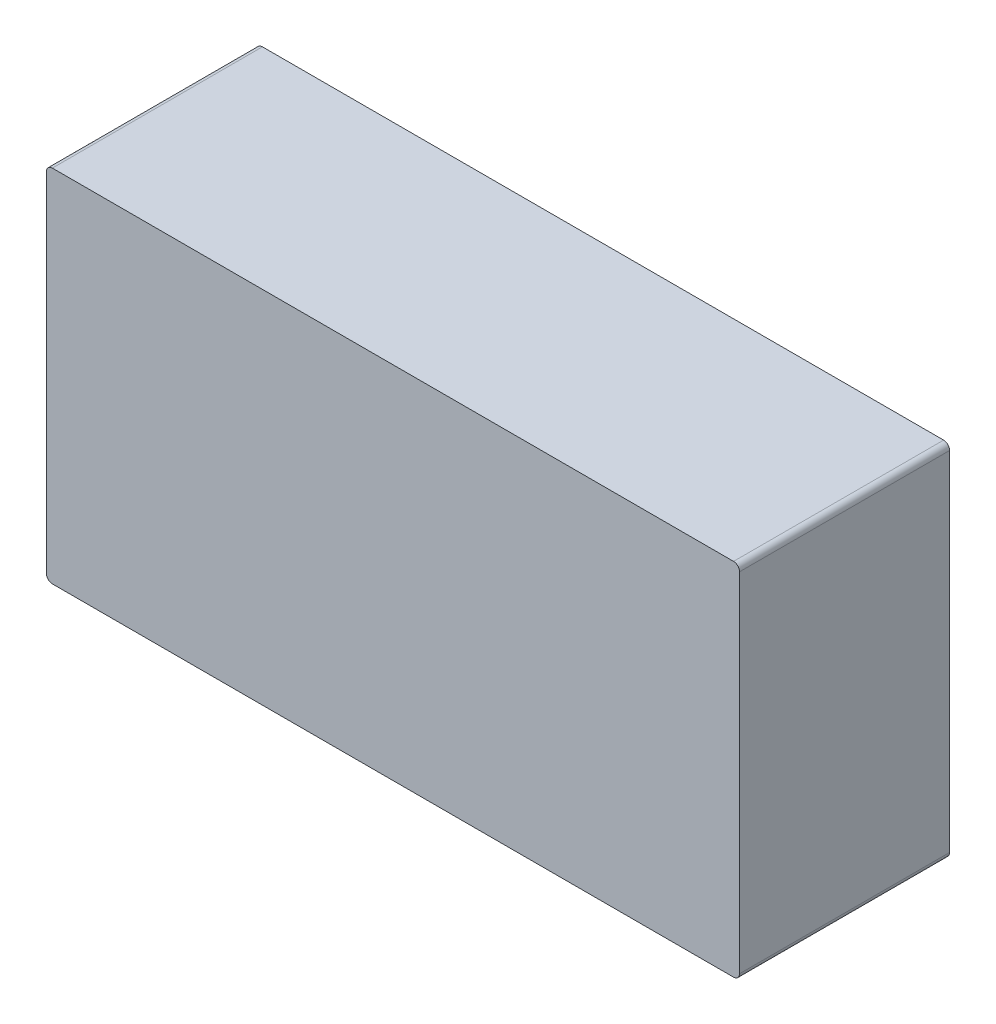
ISO-10303-21;
HEADER;
FILE_DESCRIPTION(('STEP AP214'),'2;1');
FILE_NAME('part.step','',(''),(''),'','','');
FILE_SCHEMA(('AUTOMOTIVE_DESIGN { 1 0 10303 214 1 1 1 1 }'));
ENDSEC;
DATA;
#1=APPLICATION_CONTEXT('core data for automotive mechanical design processes');
#2=APPLICATION_PROTOCOL_DEFINITION('international standard','automotive_design',2000,#1);
#3=PRODUCT_CONTEXT('',#1,'mechanical');
#4=PRODUCT('Part','Part','',(#3));
#5=PRODUCT_RELATED_PRODUCT_CATEGORY('part','',(#4));
#6=PRODUCT_DEFINITION_FORMATION('','',#4);
#7=PRODUCT_DEFINITION_CONTEXT('part definition',#1,'design');
#8=PRODUCT_DEFINITION('design','',#6,#7);
#9=PRODUCT_DEFINITION_SHAPE('','',#8);
#10=(LENGTH_UNIT() NAMED_UNIT(*) SI_UNIT(.MILLI.,.METRE.));
#11=(NAMED_UNIT(*) PLANE_ANGLE_UNIT() SI_UNIT($,.RADIAN.));
#12=(NAMED_UNIT(*) SI_UNIT($,.STERADIAN.) SOLID_ANGLE_UNIT());
#13=UNCERTAINTY_MEASURE_WITH_UNIT(LENGTH_MEASURE(1.E-05),#10,'distance_accuracy_value','');
#14=(GEOMETRIC_REPRESENTATION_CONTEXT(3) GLOBAL_UNCERTAINTY_ASSIGNED_CONTEXT((#13)) GLOBAL_UNIT_ASSIGNED_CONTEXT((#10,
#11,#12)) REPRESENTATION_CONTEXT('',''));
#15=CARTESIAN_POINT('',(0.,0.,0.));
#16=DIRECTION('',(0.,0.,1.));
#17=DIRECTION('',(1.,0.,0.));
#18=AXIS2_PLACEMENT_3D('',#15,#16,#17);
#19=CARTESIAN_POINT('',(0.,0.,14.));
#20=DIRECTION('',(0.,0.,1.));
#21=DIRECTION('',(1.,0.,0.));
#22=AXIS2_PLACEMENT_3D('',#19,#20,#21);
#23=PLANE('',#22);
#24=CARTESIAN_POINT('',(-11.15,5.8,14.));
#25=DIRECTION('',(0.,0.,-1.));
#26=DIRECTION('',(-1.,0.,0.));
#27=AXIS2_PLACEMENT_3D('',#24,#25,#26);
#28=CIRCLE('',#27,0.2);
#29=CARTESIAN_POINT('',(-11.35,5.8,14.));
#30=VERTEX_POINT('',#29);
#31=CARTESIAN_POINT('',(-11.15,6.,14.));
#32=VERTEX_POINT('',#31);
#33=EDGE_CURVE('E90',#30,#32,#28,.T.);
#34=ORIENTED_EDGE('',*,*,#33,.F.);
#35=DIRECTION('',(0.,-1.,0.));
#36=VECTOR('',#35,1.);
#37=CARTESIAN_POINT('',(-11.35,5.75,14.));
#38=LINE('',#37,#36);
#39=CARTESIAN_POINT('',(-11.35,-5.8,14.));
#40=VERTEX_POINT('',#39);
#41=EDGE_CURVE('E82',#30,#40,#38,.T.);
#42=ORIENTED_EDGE('',*,*,#41,.T.);
#43=CARTESIAN_POINT('',(-11.15,-5.8,14.));
#44=DIRECTION('',(0.,0.,-1.));
#45=DIRECTION('',(0.,-1.,0.));
#46=AXIS2_PLACEMENT_3D('',#43,#44,#45);
#47=CIRCLE('',#46,0.2);
#48=CARTESIAN_POINT('',(-11.15,-6.,14.));
#49=VERTEX_POINT('',#48);
#50=EDGE_CURVE('E59',#49,#40,#47,.T.);
#51=ORIENTED_EDGE('',*,*,#50,.F.);
#52=DIRECTION('',(1.,0.,0.));
#53=VECTOR('',#52,1.);
#54=CARTESIAN_POINT('',(-5.875,-6.,14.));
#55=LINE('',#54,#53);
#56=CARTESIAN_POINT('',(11.55,-6.,14.));
#57=VERTEX_POINT('',#56);
#58=EDGE_CURVE('E11',#49,#57,#55,.T.);
#59=ORIENTED_EDGE('',*,*,#58,.T.);
#60=CARTESIAN_POINT('',(11.55,-5.8,14.));
#61=DIRECTION('',(0.,0.,-1.));
#62=DIRECTION('',(1.,0.,0.));
#63=AXIS2_PLACEMENT_3D('',#60,#61,#62);
#64=CIRCLE('',#63,0.2);
#65=CARTESIAN_POINT('',(11.75,-5.8,14.));
#66=VERTEX_POINT('',#65);
#67=EDGE_CURVE('E64',#66,#57,#64,.T.);
#68=ORIENTED_EDGE('',*,*,#67,.F.);
#69=DIRECTION('',(0.,1.,0.));
#70=VECTOR('',#69,1.);
#71=CARTESIAN_POINT('',(11.75,0.,14.));
#72=LINE('',#71,#70);
#73=CARTESIAN_POINT('',(11.75,5.8,14.));
#74=VERTEX_POINT('',#73);
#75=EDGE_CURVE('E74',#66,#74,#72,.T.);
#76=ORIENTED_EDGE('',*,*,#75,.T.);
#77=CARTESIAN_POINT('',(11.55,5.8,14.));
#78=DIRECTION('',(0.,0.,-1.));
#79=DIRECTION('',(0.,1.,0.));
#80=AXIS2_PLACEMENT_3D('',#77,#78,#79);
#81=CIRCLE('',#80,0.2);
#82=CARTESIAN_POINT('',(11.55,6.,14.));
#83=VERTEX_POINT('',#82);
#84=EDGE_CURVE('E97',#83,#74,#81,.T.);
#85=ORIENTED_EDGE('',*,*,#84,.F.);
#86=DIRECTION('',(-1.,0.,0.));
#87=VECTOR('',#86,1.);
#88=CARTESIAN_POINT('',(5.875,6.,14.));
#89=LINE('',#88,#87);
#90=EDGE_CURVE('E93',#83,#32,#89,.T.);
#91=ORIENTED_EDGE('',*,*,#90,.T.);
#92=EDGE_LOOP('',(#34,#42,#51,#59,#68,#76,#85,#91));
#93=FACE_BOUND('',#92,.T.);
#94=ADVANCED_FACE('F17',(#93),#23,.T.);
#95=CARTESIAN_POINT('',(-11.75,-6.,0.));
#96=DIRECTION('',(0.,-1.,0.));
#97=DIRECTION('',(0.,0.,-1.));
#98=AXIS2_PLACEMENT_3D('',#95,#96,#97);
#99=PLANE('',#98);
#100=ORIENTED_EDGE('',*,*,#58,.F.);
#101=DIRECTION('',(0.,0.,1.));
#102=VECTOR('',#101,1.);
#103=CARTESIAN_POINT('',(-11.15,-6.,0.));
#104=LINE('',#103,#102);
#105=CARTESIAN_POINT('',(-11.15,-6.,7.));
#106=VERTEX_POINT('',#105);
#107=EDGE_CURVE('E54',#106,#49,#104,.T.);
#108=ORIENTED_EDGE('',*,*,#107,.F.);
#109=DIRECTION('',(1.,0.,0.));
#110=VECTOR('',#109,1.);
#111=CARTESIAN_POINT('',(-5.875,-6.,7.));
#112=LINE('',#111,#110);
#113=CARTESIAN_POINT('',(11.55,-6.,7.));
#114=VERTEX_POINT('',#113);
#115=EDGE_CURVE('E21',#106,#114,#112,.T.);
#116=ORIENTED_EDGE('',*,*,#115,.T.);
#117=DIRECTION('',(0.,0.,-1.));
#118=VECTOR('',#117,1.);
#119=CARTESIAN_POINT('',(11.55,-6.,0.));
#120=LINE('',#119,#118);
#121=EDGE_CURVE('E51',#57,#114,#120,.T.);
#122=ORIENTED_EDGE('',*,*,#121,.F.);
#123=EDGE_LOOP('',(#100,#108,#116,#122));
#124=FACE_BOUND('',#123,.T.);
#125=ADVANCED_FACE('F50',(#124),#99,.T.);
#126=CARTESIAN_POINT('',(0.,0.,7.));
#127=DIRECTION('',(0.,0.,1.));
#128=DIRECTION('',(1.,0.,0.));
#129=AXIS2_PLACEMENT_3D('',#126,#127,#128);
#130=PLANE('',#129);
#131=CARTESIAN_POINT('',(11.55,5.8,7.));
#132=DIRECTION('',(0.,0.,1.));
#133=DIRECTION('',(0.707106781186548,0.707106781186548,0.));
#134=AXIS2_PLACEMENT_3D('',#131,#132,#133);
#135=CIRCLE('',#134,0.2);
#136=CARTESIAN_POINT('',(11.75,5.8,7.));
#137=VERTEX_POINT('',#136);
#138=CARTESIAN_POINT('',(11.55,6.,7.));
#139=VERTEX_POINT('',#138);
#140=EDGE_CURVE('E101',#137,#139,#135,.T.);
#141=ORIENTED_EDGE('',*,*,#140,.F.);
#142=DIRECTION('',(0.,1.,0.));
#143=VECTOR('',#142,1.);
#144=CARTESIAN_POINT('',(11.75,-2.875,7.));
#145=LINE('',#144,#143);
#146=CARTESIAN_POINT('',(11.75,-5.8,7.));
#147=VERTEX_POINT('',#146);
#148=EDGE_CURVE('E71',#147,#137,#145,.T.);
#149=ORIENTED_EDGE('',*,*,#148,.F.);
#150=CARTESIAN_POINT('',(11.55,-5.8,7.));
#151=DIRECTION('',(0.,0.,1.));
#152=DIRECTION('',(0.707106781186548,-0.707106781186548,0.));
#153=AXIS2_PLACEMENT_3D('',#150,#151,#152);
#154=CIRCLE('',#153,0.2);
#155=EDGE_CURVE('E62',#114,#147,#154,.T.);
#156=ORIENTED_EDGE('',*,*,#155,.F.);
#157=ORIENTED_EDGE('',*,*,#115,.F.);
#158=CARTESIAN_POINT('',(-11.15,-5.8,7.));
#159=DIRECTION('',(0.,0.,1.));
#160=DIRECTION('',(-0.707106781186548,-0.707106781186548,0.));
#161=AXIS2_PLACEMENT_3D('',#158,#159,#160);
#162=CIRCLE('',#161,0.2);
#163=CARTESIAN_POINT('',(-11.35,-5.8,7.));
#164=VERTEX_POINT('',#163);
#165=EDGE_CURVE('E65',#164,#106,#162,.T.);
#166=ORIENTED_EDGE('',*,*,#165,.F.);
#167=DIRECTION('',(0.,-1.,0.));
#168=VECTOR('',#167,1.);
#169=CARTESIAN_POINT('',(-11.35,2.875,7.));
#170=LINE('',#169,#168);
#171=CARTESIAN_POINT('',(-11.35,5.8,7.));
#172=VERTEX_POINT('',#171);
#173=EDGE_CURVE('E83',#172,#164,#170,.T.);
#174=ORIENTED_EDGE('',*,*,#173,.F.);
#175=CARTESIAN_POINT('',(-11.15,5.8,7.));
#176=DIRECTION('',(0.,0.,1.));
#177=DIRECTION('',(-0.707106781186548,0.707106781186548,0.));
#178=AXIS2_PLACEMENT_3D('',#175,#176,#177);
#179=CIRCLE('',#178,0.2);
#180=CARTESIAN_POINT('',(-11.15,6.,7.));
#181=VERTEX_POINT('',#180);
#182=EDGE_CURVE('E89',#181,#172,#179,.T.);
#183=ORIENTED_EDGE('',*,*,#182,.F.);
#184=DIRECTION('',(-1.,0.,0.));
#185=VECTOR('',#184,1.);
#186=CARTESIAN_POINT('',(5.875,6.,7.));
#187=LINE('',#186,#185);
#188=EDGE_CURVE('E107',#139,#181,#187,.T.);
#189=ORIENTED_EDGE('',*,*,#188,.F.);
#190=EDGE_LOOP('',(#141,#149,#156,#157,#166,#174,#183,#189));
#191=FACE_BOUND('',#190,.T.);
#192=ADVANCED_FACE('F69',(#191),#130,.F.);
#193=CARTESIAN_POINT('',(-11.15,-5.8,0.));
#194=DIRECTION('',(0.,0.,1.));
#195=DIRECTION('',(-0.707106781186548,-0.707106781186548,0.));
#196=AXIS2_PLACEMENT_3D('',#193,#194,#195);
#197=CYLINDRICAL_SURFACE('',#196,0.2);
#198=ORIENTED_EDGE('',*,*,#165,.T.);
#199=ORIENTED_EDGE('',*,*,#107,.T.);
#200=ORIENTED_EDGE('',*,*,#50,.T.);
#201=DIRECTION('',(0.,0.,-1.));
#202=VECTOR('',#201,1.);
#203=CARTESIAN_POINT('',(-11.35,-5.8,0.));
#204=LINE('',#203,#202);
#205=EDGE_CURVE('E79',#40,#164,#204,.T.);
#206=ORIENTED_EDGE('',*,*,#205,.T.);
#207=EDGE_LOOP('',(#198,#199,#200,#206));
#208=FACE_BOUND('',#207,.T.);
#209=ADVANCED_FACE('F155',(#208),#197,.T.);
#210=CARTESIAN_POINT('',(11.55,-5.8,0.));
#211=DIRECTION('',(0.,0.,1.));
#212=DIRECTION('',(0.707106781186548,-0.707106781186548,0.));
#213=AXIS2_PLACEMENT_3D('',#210,#211,#212);
#214=CYLINDRICAL_SURFACE('',#213,0.2);
#215=ORIENTED_EDGE('',*,*,#155,.T.);
#216=DIRECTION('',(0.,0.,1.));
#217=VECTOR('',#216,1.);
#218=CARTESIAN_POINT('',(11.75,-5.8,0.));
#219=LINE('',#218,#217);
#220=EDGE_CURVE('E72',#147,#66,#219,.T.);
#221=ORIENTED_EDGE('',*,*,#220,.T.);
#222=ORIENTED_EDGE('',*,*,#67,.T.);
#223=ORIENTED_EDGE('',*,*,#121,.T.);
#224=EDGE_LOOP('',(#215,#221,#222,#223));
#225=FACE_BOUND('',#224,.T.);
#226=ADVANCED_FACE('F19',(#225),#214,.T.);
#227=CARTESIAN_POINT('',(11.75,-5.75,0.));
#228=DIRECTION('',(1.,0.,0.));
#229=DIRECTION('',(0.,1.,0.));
#230=AXIS2_PLACEMENT_3D('',#227,#228,#229);
#231=PLANE('',#230);
#232=ORIENTED_EDGE('',*,*,#148,.T.);
#233=DIRECTION('',(0.,0.,-1.));
#234=VECTOR('',#233,1.);
#235=CARTESIAN_POINT('',(11.75,5.8,0.));
#236=LINE('',#235,#234);
#237=EDGE_CURVE('E100',#74,#137,#236,.T.);
#238=ORIENTED_EDGE('',*,*,#237,.F.);
#239=ORIENTED_EDGE('',*,*,#75,.F.);
#240=ORIENTED_EDGE('',*,*,#220,.F.);
#241=EDGE_LOOP('',(#232,#238,#239,#240));
#242=FACE_BOUND('',#241,.T.);
#243=ADVANCED_FACE('F125',(#242),#231,.T.);
#244=CARTESIAN_POINT('',(-11.15,5.8,0.));
#245=DIRECTION('',(0.,0.,1.));
#246=DIRECTION('',(-0.707106781186548,0.707106781186548,0.));
#247=AXIS2_PLACEMENT_3D('',#244,#245,#246);
#248=CYLINDRICAL_SURFACE('',#247,0.2);
#249=ORIENTED_EDGE('',*,*,#182,.T.);
#250=DIRECTION('',(0.,0.,1.));
#251=VECTOR('',#250,1.);
#252=CARTESIAN_POINT('',(-11.35,5.8,0.));
#253=LINE('',#252,#251);
#254=EDGE_CURVE('E86',#172,#30,#253,.T.);
#255=ORIENTED_EDGE('',*,*,#254,.T.);
#256=ORIENTED_EDGE('',*,*,#33,.T.);
#257=DIRECTION('',(0.,0.,-1.));
#258=VECTOR('',#257,1.);
#259=CARTESIAN_POINT('',(-11.15,6.,0.));
#260=LINE('',#259,#258);
#261=EDGE_CURVE('E106',#32,#181,#260,.T.);
#262=ORIENTED_EDGE('',*,*,#261,.T.);
#263=EDGE_LOOP('',(#249,#255,#256,#262));
#264=FACE_BOUND('',#263,.T.);
#265=ADVANCED_FACE('F162',(#264),#248,.T.);
#266=CARTESIAN_POINT('',(-11.35,5.75,0.));
#267=DIRECTION('',(-1.,0.,0.));
#268=DIRECTION('',(0.,0.,1.));
#269=AXIS2_PLACEMENT_3D('',#266,#267,#268);
#270=PLANE('',#269);
#271=ORIENTED_EDGE('',*,*,#173,.T.);
#272=ORIENTED_EDGE('',*,*,#205,.F.);
#273=ORIENTED_EDGE('',*,*,#41,.F.);
#274=ORIENTED_EDGE('',*,*,#254,.F.);
#275=EDGE_LOOP('',(#271,#272,#273,#274));
#276=FACE_BOUND('',#275,.T.);
#277=ADVANCED_FACE('F160',(#276),#270,.T.);
#278=CARTESIAN_POINT('',(11.55,5.8,0.));
#279=DIRECTION('',(0.,0.,1.));
#280=DIRECTION('',(0.707106781186548,0.707106781186548,0.));
#281=AXIS2_PLACEMENT_3D('',#278,#279,#280);
#282=CYLINDRICAL_SURFACE('',#281,0.2);
#283=ORIENTED_EDGE('',*,*,#140,.T.);
#284=DIRECTION('',(0.,0.,1.));
#285=VECTOR('',#284,1.);
#286=CARTESIAN_POINT('',(11.55,6.,0.));
#287=LINE('',#286,#285);
#288=EDGE_CURVE('E96',#139,#83,#287,.T.);
#289=ORIENTED_EDGE('',*,*,#288,.T.);
#290=ORIENTED_EDGE('',*,*,#84,.T.);
#291=ORIENTED_EDGE('',*,*,#237,.T.);
#292=EDGE_LOOP('',(#283,#289,#290,#291));
#293=FACE_BOUND('',#292,.T.);
#294=ADVANCED_FACE('F131',(#293),#282,.T.);
#295=CARTESIAN_POINT('',(11.75,6.,0.));
#296=DIRECTION('',(0.,1.,0.));
#297=DIRECTION('',(1.,0.,0.));
#298=AXIS2_PLACEMENT_3D('',#295,#296,#297);
#299=PLANE('',#298);
#300=ORIENTED_EDGE('',*,*,#90,.F.);
#301=ORIENTED_EDGE('',*,*,#288,.F.);
#302=ORIENTED_EDGE('',*,*,#188,.T.);
#303=ORIENTED_EDGE('',*,*,#261,.F.);
#304=EDGE_LOOP('',(#300,#301,#302,#303));
#305=FACE_BOUND('',#304,.T.);
#306=ADVANCED_FACE('F143',(#305),#299,.T.);
#307=CLOSED_SHELL('',(#94,#125,#192,#209,#226,#243,#265,#277,#294,#306));
#308=MANIFOLD_SOLID_BREP('B1',#307);
#309=ADVANCED_BREP_SHAPE_REPRESENTATION('',(#18,#308),#14);
#310=SHAPE_DEFINITION_REPRESENTATION(#9,#309);
ENDSEC;
END-ISO-10303-21;
